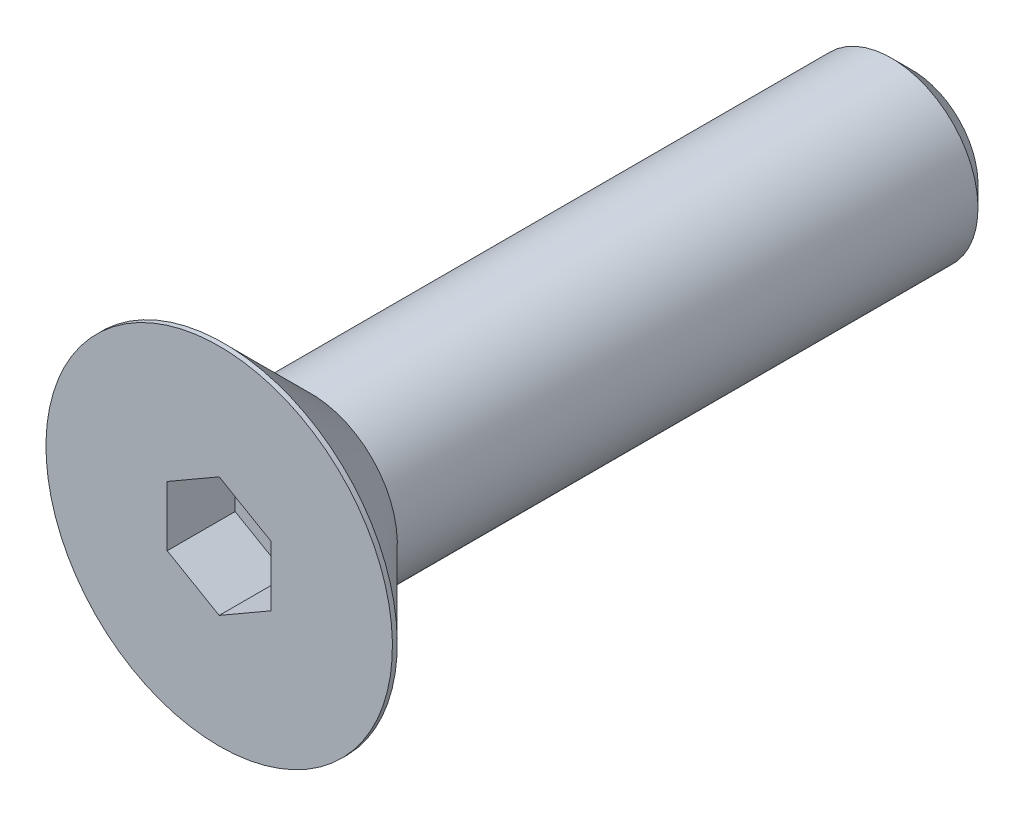
ISO-10303-21;
HEADER;
FILE_DESCRIPTION(('STEP AP214'),'2;1');
FILE_NAME('part.step','',(''),(''),'','','');
FILE_SCHEMA(('AUTOMOTIVE_DESIGN { 1 0 10303 214 1 1 1 1 }'));
ENDSEC;
DATA;
#1=APPLICATION_CONTEXT('core data for automotive mechanical design processes');
#2=APPLICATION_PROTOCOL_DEFINITION('international standard','automotive_design',2000,#1);
#3=PRODUCT_CONTEXT('',#1,'mechanical');
#4=PRODUCT('Part','Part','',(#3));
#5=PRODUCT_RELATED_PRODUCT_CATEGORY('part','',(#4));
#6=PRODUCT_DEFINITION_FORMATION('','',#4);
#7=PRODUCT_DEFINITION_CONTEXT('part definition',#1,'design');
#8=PRODUCT_DEFINITION('design','',#6,#7);
#9=PRODUCT_DEFINITION_SHAPE('','',#8);
#10=(LENGTH_UNIT() NAMED_UNIT(*) SI_UNIT(.MILLI.,.METRE.));
#11=(NAMED_UNIT(*) PLANE_ANGLE_UNIT() SI_UNIT($,.RADIAN.));
#12=(NAMED_UNIT(*) SI_UNIT($,.STERADIAN.) SOLID_ANGLE_UNIT());
#13=UNCERTAINTY_MEASURE_WITH_UNIT(LENGTH_MEASURE(1.E-05),#10,'distance_accuracy_value','');
#14=(GEOMETRIC_REPRESENTATION_CONTEXT(3) GLOBAL_UNCERTAINTY_ASSIGNED_CONTEXT((#13)) GLOBAL_UNIT_ASSIGNED_CONTEXT((#10,
#11,#12)) REPRESENTATION_CONTEXT('',''));
#15=CARTESIAN_POINT('',(0.,0.,0.));
#16=DIRECTION('',(0.,0.,1.));
#17=DIRECTION('',(1.,0.,0.));
#18=AXIS2_PLACEMENT_3D('',#15,#16,#17);
#19=CARTESIAN_POINT('',(0.,0.,9.86));
#20=DIRECTION('',(0.,0.,1.));
#21=DIRECTION('',(0.,-1.,0.));
#22=AXIS2_PLACEMENT_3D('',#19,#20,#21);
#23=CONICAL_SURFACE('',#22,5.,0.785398163397448);
#24=CARTESIAN_POINT('',(0.,0.,7.2));
#25=DIRECTION('',(0.,0.,1.));
#26=DIRECTION('',(0.,-1.,0.));
#27=AXIS2_PLACEMENT_3D('',#24,#25,#26);
#28=CIRCLE('',#27,2.34);
#29=CARTESIAN_POINT('',(0.,-2.34,7.2));
#30=VERTEX_POINT('',#29);
#31=EDGE_CURVE('E150',#30,#30,#28,.T.);
#32=ORIENTED_EDGE('',*,*,#31,.T.);
#33=EDGE_LOOP('',(#32));
#34=FACE_BOUND('',#33,.T.);
#35=CARTESIAN_POINT('',(0.,0.,9.86));
#36=DIRECTION('',(0.,0.,1.));
#37=DIRECTION('',(0.,-1.,0.));
#38=AXIS2_PLACEMENT_3D('',#35,#36,#37);
#39=CIRCLE('',#38,5.);
#40=CARTESIAN_POINT('',(0.,-5.,9.86));
#41=VERTEX_POINT('',#40);
#42=EDGE_CURVE('E12',#41,#41,#39,.T.);
#43=ORIENTED_EDGE('',*,*,#42,.F.);
#44=EDGE_LOOP('',(#43));
#45=FACE_BOUND('',#44,.T.);
#46=ADVANCED_FACE('F49',(#34,#45),#23,.T.);
#47=CARTESIAN_POINT('',(0.,0.,10.));
#48=DIRECTION('',(0.,0.,1.));
#49=DIRECTION('',(0.,-1.,0.));
#50=AXIS2_PLACEMENT_3D('',#47,#48,#49);
#51=CYLINDRICAL_SURFACE('',#50,5.);
#52=ORIENTED_EDGE('',*,*,#42,.T.);
#53=EDGE_LOOP('',(#52));
#54=FACE_BOUND('',#53,.T.);
#55=CARTESIAN_POINT('',(0.,0.,10.));
#56=DIRECTION('',(0.,0.,1.));
#57=DIRECTION('',(0.,-1.,0.));
#58=AXIS2_PLACEMENT_3D('',#55,#56,#57);
#59=CIRCLE('',#58,5.);
#60=CARTESIAN_POINT('',(0.,-5.,10.));
#61=VERTEX_POINT('',#60);
#62=EDGE_CURVE('E56',#61,#61,#59,.T.);
#63=ORIENTED_EDGE('',*,*,#62,.F.);
#64=EDGE_LOOP('',(#63));
#65=FACE_BOUND('',#64,.T.);
#66=ADVANCED_FACE('F162',(#54,#65),#51,.T.);
#67=CARTESIAN_POINT('',(0.,0.,10.));
#68=DIRECTION('',(0.,0.,-1.));
#69=DIRECTION('',(0.,1.,0.));
#70=AXIS2_PLACEMENT_3D('',#67,#68,#69);
#71=PLANE('',#70);
#72=DIRECTION('',(0.,1.,0.));
#73=VECTOR('',#72,1.);
#74=CARTESIAN_POINT('',(1.5,-0.86602540378444,10.));
#75=LINE('',#74,#73);
#76=CARTESIAN_POINT('',(1.5,-0.86602540378444,10.));
#77=VERTEX_POINT('',#76);
#78=CARTESIAN_POINT('',(1.5,0.866025403784438,10.));
#79=VERTEX_POINT('',#78);
#80=EDGE_CURVE('E137',#77,#79,#75,.T.);
#81=ORIENTED_EDGE('',*,*,#80,.F.);
#82=DIRECTION('',(0.866025403784438,0.5,0.));
#83=VECTOR('',#82,1.);
#84=CARTESIAN_POINT('',(0.,-1.73205080756888,10.));
#85=LINE('',#84,#83);
#86=CARTESIAN_POINT('',(0.,-1.73205080756888,10.));
#87=VERTEX_POINT('',#86);
#88=EDGE_CURVE('E63',#87,#77,#85,.T.);
#89=ORIENTED_EDGE('',*,*,#88,.F.);
#90=DIRECTION('',(0.866025403784439,-0.5,0.));
#91=VECTOR('',#90,1.);
#92=CARTESIAN_POINT('',(-1.5,-0.866025403784442,10.));
#93=LINE('',#92,#91);
#94=CARTESIAN_POINT('',(-1.5,-0.866025403784442,10.));
#95=VERTEX_POINT('',#94);
#96=EDGE_CURVE('E146',#95,#87,#93,.T.);
#97=ORIENTED_EDGE('',*,*,#96,.F.);
#98=DIRECTION('',(0.,-1.,0.));
#99=VECTOR('',#98,1.);
#100=CARTESIAN_POINT('',(-1.5,0.866025403784437,10.));
#101=LINE('',#100,#99);
#102=CARTESIAN_POINT('',(-1.5,0.866025403784437,10.));
#103=VERTEX_POINT('',#102);
#104=EDGE_CURVE('E144',#103,#95,#101,.T.);
#105=ORIENTED_EDGE('',*,*,#104,.F.);
#106=DIRECTION('',(-0.866025403784439,-0.5,0.));
#107=VECTOR('',#106,1.);
#108=CARTESIAN_POINT('',(0.,1.73205080756888,10.));
#109=LINE('',#108,#107);
#110=CARTESIAN_POINT('',(0.,1.73205080756888,10.));
#111=VERTEX_POINT('',#110);
#112=EDGE_CURVE('E111',#111,#103,#109,.T.);
#113=ORIENTED_EDGE('',*,*,#112,.F.);
#114=DIRECTION('',(-0.866025403784439,0.5,0.));
#115=VECTOR('',#114,1.);
#116=CARTESIAN_POINT('',(1.5,0.866025403784438,10.));
#117=LINE('',#116,#115);
#118=EDGE_CURVE('E140',#79,#111,#117,.T.);
#119=ORIENTED_EDGE('',*,*,#118,.F.);
#120=EDGE_LOOP('',(#81,#89,#97,#105,#113,#119));
#121=FACE_BOUND('',#120,.T.);
#122=ORIENTED_EDGE('',*,*,#62,.T.);
#123=EDGE_LOOP('',(#122));
#124=FACE_BOUND('',#123,.T.);
#125=ADVANCED_FACE('F160',(#121,#124),#71,.F.);
#126=CARTESIAN_POINT('',(0.,0.,7.2));
#127=DIRECTION('',(0.,0.,-1.));
#128=DIRECTION('',(0.,1.,0.));
#129=AXIS2_PLACEMENT_3D('',#126,#127,#128);
#130=PLANE('',#129);
#131=ORIENTED_EDGE('',*,*,#31,.F.);
#132=EDGE_LOOP('',(#131));
#133=FACE_BOUND('',#132,.T.);
#134=ADVANCED_FACE('F169',(#133),#130,.T.);
#135=CARTESIAN_POINT('',(0.,-1.73205080756888,8.04));
#136=DIRECTION('',(0.5,-0.866025403784438,0.));
#137=DIRECTION('',(0.866025403784438,0.5,0.));
#138=AXIS2_PLACEMENT_3D('',#135,#136,#137);
#139=PLANE('',#138);
#140=ORIENTED_EDGE('',*,*,#88,.T.);
#141=DIRECTION('',(0.,0.,1.));
#142=VECTOR('',#141,1.);
#143=CARTESIAN_POINT('',(1.5,-0.86602540378444,8.04));
#144=LINE('',#143,#142);
#145=CARTESIAN_POINT('',(1.5,-0.86602540378444,8.04));
#146=VERTEX_POINT('',#145);
#147=EDGE_CURVE('E93',#146,#77,#144,.T.);
#148=ORIENTED_EDGE('',*,*,#147,.F.);
#149=DIRECTION('',(0.866025403784438,0.5,0.));
#150=VECTOR('',#149,1.);
#151=CARTESIAN_POINT('',(0.,-1.73205080756888,8.04));
#152=LINE('',#151,#150);
#153=CARTESIAN_POINT('',(0.,-1.73205080756888,8.04));
#154=VERTEX_POINT('',#153);
#155=EDGE_CURVE('E148',#154,#146,#152,.T.);
#156=ORIENTED_EDGE('',*,*,#155,.F.);
#157=DIRECTION('',(0.,0.,1.));
#158=VECTOR('',#157,1.);
#159=CARTESIAN_POINT('',(0.,-1.73205080756888,8.04));
#160=LINE('',#159,#158);
#161=EDGE_CURVE('E71',#154,#87,#160,.T.);
#162=ORIENTED_EDGE('',*,*,#161,.T.);
#163=EDGE_LOOP('',(#140,#148,#156,#162));
#164=FACE_BOUND('',#163,.T.);
#165=ADVANCED_FACE('F176',(#164),#139,.F.);
#166=CARTESIAN_POINT('',(-1.5,-0.866025403784442,8.04));
#167=DIRECTION('',(-0.5,-0.866025403784439,0.));
#168=DIRECTION('',(0.866025403784439,-0.5,0.));
#169=AXIS2_PLACEMENT_3D('',#166,#167,#168);
#170=PLANE('',#169);
#171=ORIENTED_EDGE('',*,*,#96,.T.);
#172=ORIENTED_EDGE('',*,*,#161,.F.);
#173=DIRECTION('',(0.866025403784439,-0.5,0.));
#174=VECTOR('',#173,1.);
#175=CARTESIAN_POINT('',(-1.5,-0.866025403784442,8.04));
#176=LINE('',#175,#174);
#177=CARTESIAN_POINT('',(-1.5,-0.866025403784442,8.04));
#178=VERTEX_POINT('',#177);
#179=EDGE_CURVE('E123',#178,#154,#176,.T.);
#180=ORIENTED_EDGE('',*,*,#179,.F.);
#181=DIRECTION('',(0.,0.,1.));
#182=VECTOR('',#181,1.);
#183=CARTESIAN_POINT('',(-1.5,-0.866025403784442,8.04));
#184=LINE('',#183,#182);
#185=EDGE_CURVE('E115',#178,#95,#184,.T.);
#186=ORIENTED_EDGE('',*,*,#185,.T.);
#187=EDGE_LOOP('',(#171,#172,#180,#186));
#188=FACE_BOUND('',#187,.T.);
#189=ADVANCED_FACE('F180',(#188),#170,.F.);
#190=CARTESIAN_POINT('',(-1.5,0.866025403784437,8.04));
#191=DIRECTION('',(-1.,0.,0.));
#192=DIRECTION('',(0.,-1.,0.));
#193=AXIS2_PLACEMENT_3D('',#190,#191,#192);
#194=PLANE('',#193);
#195=ORIENTED_EDGE('',*,*,#104,.T.);
#196=ORIENTED_EDGE('',*,*,#185,.F.);
#197=DIRECTION('',(0.,-1.,0.));
#198=VECTOR('',#197,1.);
#199=CARTESIAN_POINT('',(-1.5,0.866025403784437,8.04));
#200=LINE('',#199,#198);
#201=CARTESIAN_POINT('',(-1.5,0.866025403784437,8.04));
#202=VERTEX_POINT('',#201);
#203=EDGE_CURVE('E119',#202,#178,#200,.T.);
#204=ORIENTED_EDGE('',*,*,#203,.F.);
#205=DIRECTION('',(0.,0.,1.));
#206=VECTOR('',#205,1.);
#207=CARTESIAN_POINT('',(-1.5,0.866025403784437,8.04));
#208=LINE('',#207,#206);
#209=EDGE_CURVE('E104',#202,#103,#208,.T.);
#210=ORIENTED_EDGE('',*,*,#209,.T.);
#211=EDGE_LOOP('',(#195,#196,#204,#210));
#212=FACE_BOUND('',#211,.T.);
#213=ADVANCED_FACE('F120',(#212),#194,.F.);
#214=CARTESIAN_POINT('',(0.,1.73205080756888,8.04));
#215=DIRECTION('',(-0.5,0.866025403784438,0.));
#216=DIRECTION('',(-0.866025403784439,-0.5,0.));
#217=AXIS2_PLACEMENT_3D('',#214,#215,#216);
#218=PLANE('',#217);
#219=ORIENTED_EDGE('',*,*,#112,.T.);
#220=ORIENTED_EDGE('',*,*,#209,.F.);
#221=DIRECTION('',(-0.866025403784439,-0.5,0.));
#222=VECTOR('',#221,1.);
#223=CARTESIAN_POINT('',(0.,1.73205080756888,8.04));
#224=LINE('',#223,#222);
#225=CARTESIAN_POINT('',(0.,1.73205080756888,8.04));
#226=VERTEX_POINT('',#225);
#227=EDGE_CURVE('E108',#226,#202,#224,.T.);
#228=ORIENTED_EDGE('',*,*,#227,.F.);
#229=DIRECTION('',(0.,0.,1.));
#230=VECTOR('',#229,1.);
#231=CARTESIAN_POINT('',(0.,1.73205080756888,8.04));
#232=LINE('',#231,#230);
#233=EDGE_CURVE('E116',#226,#111,#232,.T.);
#234=ORIENTED_EDGE('',*,*,#233,.T.);
#235=EDGE_LOOP('',(#219,#220,#228,#234));
#236=FACE_BOUND('',#235,.T.);
#237=ADVANCED_FACE('F106',(#236),#218,.F.);
#238=CARTESIAN_POINT('',(1.5,0.866025403784438,8.04));
#239=DIRECTION('',(0.5,0.866025403784439,0.));
#240=DIRECTION('',(-0.866025403784439,0.5,0.));
#241=AXIS2_PLACEMENT_3D('',#238,#239,#240);
#242=PLANE('',#241);
#243=ORIENTED_EDGE('',*,*,#118,.T.);
#244=ORIENTED_EDGE('',*,*,#233,.F.);
#245=DIRECTION('',(-0.866025403784439,0.5,0.));
#246=VECTOR('',#245,1.);
#247=CARTESIAN_POINT('',(1.5,0.866025403784438,8.04));
#248=LINE('',#247,#246);
#249=CARTESIAN_POINT('',(1.5,0.866025403784438,8.04));
#250=VERTEX_POINT('',#249);
#251=EDGE_CURVE('E129',#250,#226,#248,.T.);
#252=ORIENTED_EDGE('',*,*,#251,.F.);
#253=DIRECTION('',(0.,0.,1.));
#254=VECTOR('',#253,1.);
#255=CARTESIAN_POINT('',(1.5,0.866025403784438,8.04));
#256=LINE('',#255,#254);
#257=EDGE_CURVE('E153',#250,#79,#256,.T.);
#258=ORIENTED_EDGE('',*,*,#257,.T.);
#259=EDGE_LOOP('',(#243,#244,#252,#258));
#260=FACE_BOUND('',#259,.T.);
#261=ADVANCED_FACE('F184',(#260),#242,.F.);
#262=CARTESIAN_POINT('',(1.5,-0.86602540378444,8.04));
#263=DIRECTION('',(1.,0.,0.));
#264=DIRECTION('',(0.,0.,-1.));
#265=AXIS2_PLACEMENT_3D('',#262,#263,#264);
#266=PLANE('',#265);
#267=ORIENTED_EDGE('',*,*,#80,.T.);
#268=ORIENTED_EDGE('',*,*,#257,.F.);
#269=DIRECTION('',(0.,1.,0.));
#270=VECTOR('',#269,1.);
#271=CARTESIAN_POINT('',(1.5,-0.86602540378444,8.04));
#272=LINE('',#271,#270);
#273=EDGE_CURVE('E131',#146,#250,#272,.T.);
#274=ORIENTED_EDGE('',*,*,#273,.F.);
#275=ORIENTED_EDGE('',*,*,#147,.T.);
#276=EDGE_LOOP('',(#267,#268,#274,#275));
#277=FACE_BOUND('',#276,.T.);
#278=ADVANCED_FACE('F181',(#277),#266,.F.);
#279=CARTESIAN_POINT('',(1.5,-0.86602540378444,8.04));
#280=DIRECTION('',(0.,0.,1.));
#281=DIRECTION('',(1.,0.,0.));
#282=AXIS2_PLACEMENT_3D('',#279,#280,#281);
#283=PLANE('',#282);
#284=ORIENTED_EDGE('',*,*,#155,.T.);
#285=ORIENTED_EDGE('',*,*,#273,.T.);
#286=ORIENTED_EDGE('',*,*,#251,.T.);
#287=ORIENTED_EDGE('',*,*,#227,.T.);
#288=ORIENTED_EDGE('',*,*,#203,.T.);
#289=ORIENTED_EDGE('',*,*,#179,.T.);
#290=EDGE_LOOP('',(#284,#285,#286,#287,#288,#289));
#291=FACE_BOUND('',#290,.T.);
#292=ADVANCED_FACE('F126',(#291),#283,.T.);
#293=CLOSED_SHELL('',(#46,#66,#125,#134,#165,#189,#213,#237,#261,#278,#292));
#294=MANIFOLD_SOLID_BREP('B2',#293);
#295=CARTESIAN_POINT('',(0.,-2.50000000000001,8.04));
#296=DIRECTION('',(0.,0.,-1.));
#297=DIRECTION('',(0.,1.,0.));
#298=AXIS2_PLACEMENT_3D('',#295,#296,#297);
#299=PLANE('',#298);
#300=CARTESIAN_POINT('',(0.,0.,8.03999999999999));
#301=DIRECTION('',(0.,0.,1.));
#302=DIRECTION('',(0.,-1.,0.));
#303=AXIS2_PLACEMENT_3D('',#300,#301,#302);
#304=CIRCLE('',#303,2.50000000000001);
#305=CARTESIAN_POINT('',(0.,-2.50000000000001,8.03999999999999));
#306=VERTEX_POINT('',#305);
#307=EDGE_CURVE('E283',#306,#306,#304,.T.);
#308=ORIENTED_EDGE('',*,*,#307,.T.);
#309=EDGE_LOOP('',(#308));
#310=FACE_BOUND('',#309,.T.);
#311=ADVANCED_FACE('F270',(#310),#299,.F.);
#312=CARTESIAN_POINT('',(0.,-2.5,-9.99999999999999));
#313=DIRECTION('',(0.,0.,1.));
#314=DIRECTION('',(0.,-1.,0.));
#315=AXIS2_PLACEMENT_3D('',#312,#313,#314);
#316=PLANE('',#315);
#317=CARTESIAN_POINT('',(0.,0.,-9.99999999999999));
#318=DIRECTION('',(0.,0.,1.));
#319=DIRECTION('',(0.,-1.,0.));
#320=AXIS2_PLACEMENT_3D('',#317,#318,#319);
#321=CIRCLE('',#320,1.9);
#322=CARTESIAN_POINT('',(0.,-1.9,-9.99999999999999));
#323=VERTEX_POINT('',#322);
#324=EDGE_CURVE('E48',#323,#323,#321,.F.);
#325=ORIENTED_EDGE('',*,*,#324,.T.);
#326=EDGE_LOOP('',(#325));
#327=FACE_BOUND('',#326,.T.);
#328=ADVANCED_FACE('F294',(#327),#316,.F.);
#329=CARTESIAN_POINT('',(0.,0.,8.04));
#330=DIRECTION('',(0.,0.,1.));
#331=DIRECTION('',(0.,-1.,0.));
#332=AXIS2_PLACEMENT_3D('',#329,#330,#331);
#333=CYLINDRICAL_SURFACE('',#332,2.50000000000001);
#334=CARTESIAN_POINT('',(0.,0.,-9.39999999999999));
#335=DIRECTION('',(0.,0.,1.));
#336=DIRECTION('',(0.,-1.,0.));
#337=AXIS2_PLACEMENT_3D('',#334,#335,#336);
#338=CIRCLE('',#337,2.50000000000001);
#339=CARTESIAN_POINT('',(0.,-2.50000000000001,-9.39999999999999));
#340=VERTEX_POINT('',#339);
#341=EDGE_CURVE('E278',#340,#340,#338,.T.);
#342=ORIENTED_EDGE('',*,*,#341,.T.);
#343=EDGE_LOOP('',(#342));
#344=FACE_BOUND('',#343,.T.);
#345=ORIENTED_EDGE('',*,*,#307,.F.);
#346=EDGE_LOOP('',(#345));
#347=FACE_BOUND('',#346,.T.);
#348=ADVANCED_FACE('F292',(#344,#347),#333,.T.);
#349=CARTESIAN_POINT('',(0.,0.,-9.39999999999999));
#350=DIRECTION('',(0.,0.,1.));
#351=DIRECTION('',(0.,-1.,0.));
#352=AXIS2_PLACEMENT_3D('',#349,#350,#351);
#353=CONICAL_SURFACE('',#352,2.50000000000001,0.785398163397449);
#354=ORIENTED_EDGE('',*,*,#324,.F.);
#355=EDGE_LOOP('',(#354));
#356=FACE_BOUND('',#355,.T.);
#357=ORIENTED_EDGE('',*,*,#341,.F.);
#358=EDGE_LOOP('',(#357));
#359=FACE_BOUND('',#358,.T.);
#360=ADVANCED_FACE('F272',(#356,#359),#353,.T.);
#361=CLOSED_SHELL('',(#311,#328,#348,#360));
#362=MANIFOLD_SOLID_BREP('B6',#361);
#363=ADVANCED_BREP_SHAPE_REPRESENTATION('',(#18,#294,#362),#14);
#364=SHAPE_DEFINITION_REPRESENTATION(#9,#363);
ENDSEC;
END-ISO-10303-21;
